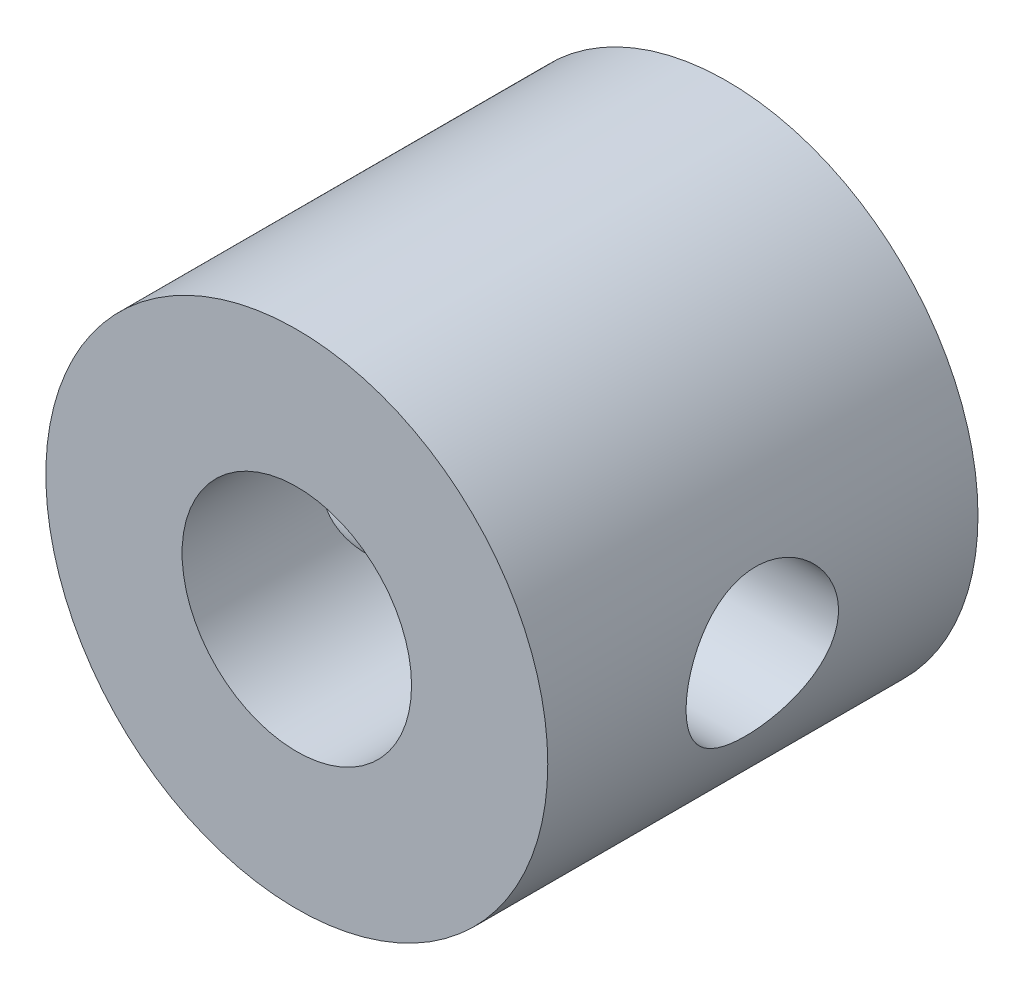
ISO-10303-21;
HEADER;
FILE_DESCRIPTION(('STEP AP214'),'2;1');
FILE_NAME('part.step','',(''),(''),'','','');
FILE_SCHEMA(('AUTOMOTIVE_DESIGN { 1 0 10303 214 1 1 1 1 }'));
ENDSEC;
DATA;
#1=APPLICATION_CONTEXT('core data for automotive mechanical design processes');
#2=APPLICATION_PROTOCOL_DEFINITION('international standard','automotive_design',2000,#1);
#3=PRODUCT_CONTEXT('',#1,'mechanical');
#4=PRODUCT('Part','Part','',(#3));
#5=PRODUCT_RELATED_PRODUCT_CATEGORY('part','',(#4));
#6=PRODUCT_DEFINITION_FORMATION('','',#4);
#7=PRODUCT_DEFINITION_CONTEXT('part definition',#1,'design');
#8=PRODUCT_DEFINITION('design','',#6,#7);
#9=PRODUCT_DEFINITION_SHAPE('','',#8);
#10=(LENGTH_UNIT() NAMED_UNIT(*) SI_UNIT(.MILLI.,.METRE.));
#11=(NAMED_UNIT(*) PLANE_ANGLE_UNIT() SI_UNIT($,.RADIAN.));
#12=(NAMED_UNIT(*) SI_UNIT($,.STERADIAN.) SOLID_ANGLE_UNIT());
#13=UNCERTAINTY_MEASURE_WITH_UNIT(LENGTH_MEASURE(1.E-05),#10,'distance_accuracy_value','');
#14=(GEOMETRIC_REPRESENTATION_CONTEXT(3) GLOBAL_UNCERTAINTY_ASSIGNED_CONTEXT((#13)) GLOBAL_UNIT_ASSIGNED_CONTEXT((#10,
#11,#12)) REPRESENTATION_CONTEXT('',''));
#15=CARTESIAN_POINT('',(0.,0.,0.));
#16=DIRECTION('',(0.,0.,1.));
#17=DIRECTION('',(1.,0.,0.));
#18=AXIS2_PLACEMENT_3D('',#15,#16,#17);
#19=CARTESIAN_POINT('',(0.,0.,19.05));
#20=DIRECTION('',(0.,0.,1.));
#21=DIRECTION('',(1.,0.,0.));
#22=AXIS2_PLACEMENT_3D('',#19,#20,#21);
#23=PLANE('',#22);
#24=CARTESIAN_POINT('',(0.,0.,19.05));
#25=DIRECTION('',(0.,0.,1.));
#26=DIRECTION('',(1.,0.,0.));
#27=AXIS2_PLACEMENT_3D('',#24,#25,#26);
#28=CIRCLE('',#27,11.1125);
#29=CARTESIAN_POINT('',(11.1125,0.,19.05));
#30=VERTEX_POINT('',#29);
#31=EDGE_CURVE('E10',#30,#30,#28,.T.);
#32=ORIENTED_EDGE('',*,*,#31,.T.);
#33=EDGE_LOOP('',(#32));
#34=FACE_BOUND('',#33,.T.);
#35=CARTESIAN_POINT('',(0.,0.,19.05));
#36=DIRECTION('',(0.,0.,1.));
#37=DIRECTION('',(1.,0.,0.));
#38=AXIS2_PLACEMENT_3D('',#35,#36,#37);
#39=CIRCLE('',#38,5.08);
#40=CARTESIAN_POINT('',(5.08,0.,19.05));
#41=VERTEX_POINT('',#40);
#42=EDGE_CURVE('E49',#41,#41,#39,.T.);
#43=ORIENTED_EDGE('',*,*,#42,.F.);
#44=EDGE_LOOP('',(#43));
#45=FACE_BOUND('',#44,.T.);
#46=ADVANCED_FACE('F31',(#34,#45),#23,.T.);
#47=CARTESIAN_POINT('',(0.,0.,0.));
#48=DIRECTION('',(0.,0.,1.));
#49=DIRECTION('',(1.,0.,0.));
#50=AXIS2_PLACEMENT_3D('',#47,#48,#49);
#51=PLANE('',#50);
#52=CARTESIAN_POINT('',(0.,0.,0.));
#53=DIRECTION('',(0.,0.,1.));
#54=DIRECTION('',(1.,0.,0.));
#55=AXIS2_PLACEMENT_3D('',#52,#53,#54);
#56=CIRCLE('',#55,11.1125);
#57=CARTESIAN_POINT('',(11.1125,0.,0.));
#58=VERTEX_POINT('',#57);
#59=EDGE_CURVE('E44',#58,#58,#56,.T.);
#60=ORIENTED_EDGE('',*,*,#59,.F.);
#61=EDGE_LOOP('',(#60));
#62=FACE_BOUND('',#61,.T.);
#63=CARTESIAN_POINT('',(0.,0.,0.));
#64=DIRECTION('',(0.,0.,1.));
#65=DIRECTION('',(1.,0.,0.));
#66=AXIS2_PLACEMENT_3D('',#63,#64,#65);
#67=CIRCLE('',#66,5.08);
#68=CARTESIAN_POINT('',(5.08,0.,0.));
#69=VERTEX_POINT('',#68);
#70=EDGE_CURVE('E52',#69,#69,#67,.T.);
#71=ORIENTED_EDGE('',*,*,#70,.T.);
#72=EDGE_LOOP('',(#71));
#73=FACE_BOUND('',#72,.T.);
#74=ADVANCED_FACE('F85',(#62,#73),#51,.F.);
#75=CARTESIAN_POINT('',(0.,0.,19.05));
#76=DIRECTION('',(0.,0.,-1.));
#77=DIRECTION('',(-1.,0.,0.));
#78=AXIS2_PLACEMENT_3D('',#75,#76,#77);
#79=CYLINDRICAL_SURFACE('',#78,11.1125);
#80=CARTESIAN_POINT('',(-11.1125,0.,12.8137149679314));
#81=CARTESIAN_POINT('',(-11.1124984958869,-0.179075031938462,12.8526354495436));
#82=CARTESIAN_POINT('',(-11.1081310056165,-0.361354755887228,12.8768895467676));
#83=CARTESIAN_POINT('',(-11.0902051525725,-0.726991149455643,12.8954539288409));
#84=CARTESIAN_POINT('',(-11.0766457779454,-0.910347935436447,12.8897609166105));
#85=CARTESIAN_POINT('',(-11.040883401534,-1.27266099769968,12.8489419987937));
#86=CARTESIAN_POINT('',(-11.0186898192915,-1.45162184433142,12.8138481203019));
#87=CARTESIAN_POINT('',(-10.9670727726402,-1.80058790649614,12.7156951163462));
#88=CARTESIAN_POINT('',(-10.9376482444434,-1.97059179984501,12.652631875042));
#89=CARTESIAN_POINT('',(-10.8729596061058,-2.30117890194719,12.4988829801458));
#90=CARTESIAN_POINT('',(-10.8375794531389,-2.4614657853009,12.4076102258045));
#91=CARTESIAN_POINT('',(-10.7642297854076,-2.76466688084742,12.2005148699386));
#92=CARTESIAN_POINT('',(-10.7262595254629,-2.90757606024488,12.0846851829464));
#93=CARTESIAN_POINT('',(-10.6491431055406,-3.17870581915587,11.8255419566447));
#94=CARTESIAN_POINT('',(-10.6100205953806,-3.30598001546618,11.6812286770229));
#95=CARTESIAN_POINT('',(-10.5360832001716,-3.53455499799976,11.372297273104));
#96=CARTESIAN_POINT('',(-10.5012684496236,-3.63585497333743,11.2076785151306));
#97=CARTESIAN_POINT('',(-10.4397941021162,-3.80877557453693,10.8632245172453));
#98=CARTESIAN_POINT('',(-10.4130908236302,-3.88055593634923,10.6834776877716));
#99=CARTESIAN_POINT('',(-10.370723584819,-3.99241577506109,10.3131638919057));
#100=CARTESIAN_POINT('',(-10.3550534436487,-4.03251300262836,10.1226030483679));
#101=CARTESIAN_POINT('',(-10.3372964071536,-4.07780671225773,9.74872603845862));
#102=CARTESIAN_POINT('',(-10.3344314952299,-4.08500285712875,9.56568774009725));
#103=CARTESIAN_POINT('',(-10.3404900799236,-4.06964262018829,9.20108138933902));
#104=CARTESIAN_POINT('',(-10.3494118039243,-4.04709071224907,9.01951311999297));
#105=CARTESIAN_POINT('',(-10.3775348352611,-3.97439994878839,8.66906657167486));
#106=CARTESIAN_POINT('',(-10.3963929965016,-3.9251805158688,8.49996767946618));
#107=CARTESIAN_POINT('',(-10.4422404357623,-3.80152523070773,8.1724475067097));
#108=CARTESIAN_POINT('',(-10.4692313459411,-3.72708431640212,8.01402837729684));
#109=CARTESIAN_POINT('',(-10.5301220309247,-3.55150039185283,7.70492409807499));
#110=CARTESIAN_POINT('',(-10.5642680682432,-3.44935086861727,7.55486018950909));
#111=CARTESIAN_POINT('',(-10.6355860385673,-3.22274107008864,7.27344422087008));
#112=CARTESIAN_POINT('',(-10.6727589870526,-3.09827329040754,7.14209848141968));
#113=CARTESIAN_POINT('',(-10.7492153163253,-2.8220057816087,6.89388747621948));
#114=CARTESIAN_POINT('',(-10.788494410734,-2.66903008040879,6.77832588237892));
#115=CARTESIAN_POINT('',(-10.8635166833034,-2.34505414127678,6.57449194480493));
#116=CARTESIAN_POINT('',(-10.8992597272806,-2.17405321984427,6.48622063639453));
#117=CARTESIAN_POINT('',(-10.9642576398156,-1.81809323381588,6.33965267163597));
#118=CARTESIAN_POINT('',(-10.9935011657997,-1.63311051107308,6.28140818625076));
#119=CARTESIAN_POINT('',(-11.0430777176784,-1.25476347431372,6.19745654718428));
#120=CARTESIAN_POINT('',(-11.0634138134944,-1.0614020732743,6.17173817768911));
#121=CARTESIAN_POINT('',(-11.0931603558285,-0.68127505866541,6.15454061996468));
#122=CARTESIAN_POINT('',(-11.103028676321,-0.494613128781895,6.16154674297758));
#123=CARTESIAN_POINT('',(-11.1133386408661,-0.124780310168476,6.20639408045858));
#124=CARTESIAN_POINT('',(-11.1137816002833,0.058391062124508,6.24423099154359));
#125=CARTESIAN_POINT('',(-11.1062573317802,0.41119731401626,6.34825871203173));
#126=CARTESIAN_POINT('',(-11.0985040351713,0.581058146600553,6.41370276162586));
#127=CARTESIAN_POINT('',(-11.0765771595107,0.907699396683724,6.57086165180119));
#128=CARTESIAN_POINT('',(-11.0624028563396,1.06447833652981,6.66257945493631));
#129=CARTESIAN_POINT('',(-11.0295081071124,1.36412335640241,6.87193319168137));
#130=CARTESIAN_POINT('',(-11.0106977613136,1.50662458368296,6.9900767650067));
#131=CARTESIAN_POINT('',(-10.9713971566341,1.77028372102719,7.24795130855053));
#132=CARTESIAN_POINT('',(-10.9509065731471,1.89143749265963,7.38768645469176));
#133=CARTESIAN_POINT('',(-10.910452073569,2.11251499122834,7.68955384367131));
#134=CARTESIAN_POINT('',(-10.8905209270152,2.2117168187426,7.85222027439945));
#135=CARTESIAN_POINT('',(-10.8546781599764,2.38142390343155,8.19230642469252));
#136=CARTESIAN_POINT('',(-10.8387662515409,2.45193121659029,8.36972508615137));
#137=CARTESIAN_POINT('',(-10.8133554811772,2.56167519178917,8.73313276866773));
#138=CARTESIAN_POINT('',(-10.8038141086656,2.60111946145896,8.91905594901472));
#139=CARTESIAN_POINT('',(-10.7923782866731,2.64817563557378,9.29510522197456));
#140=CARTESIAN_POINT('',(-10.7904824083849,2.65579348782107,9.48523052260732));
#141=CARTESIAN_POINT('',(-10.7945595895509,2.63916524082101,9.85904650985719));
#142=CARTESIAN_POINT('',(-10.8003305435609,2.61573757341234,10.0427765025938));
#143=CARTESIAN_POINT('',(-10.8185739484829,2.53922057986665,10.4035979189015));
#144=CARTESIAN_POINT('',(-10.8310467094008,2.48612988160114,10.5806890349725));
#145=CARTESIAN_POINT('',(-10.861030140562,2.35168230630612,10.92406493944));
#146=CARTESIAN_POINT('',(-10.8785590640075,2.27022279031239,11.0903078496124));
#147=CARTESIAN_POINT('',(-10.9162640628714,2.08136426059485,11.4070324703487));
#148=CARTESIAN_POINT('',(-10.9364407156113,1.97395958537844,11.5575107306199));
#149=CARTESIAN_POINT('',(-10.9772648126028,1.73281039430189,11.8426634738809));
#150=CARTESIAN_POINT('',(-10.99791045191,1.59843946658581,11.9768090618692));
#151=CARTESIAN_POINT('',(-11.0361178744893,1.30883086033706,12.2207976884783));
#152=CARTESIAN_POINT('',(-11.0536803305091,1.15359774699849,12.3306460300993));
#153=CARTESIAN_POINT('',(-11.0820065820158,0.836905042529225,12.5167115754777));
#154=CARTESIAN_POINT('',(-11.0931326893706,0.676474820539089,12.5946275051758));
#155=CARTESIAN_POINT('',(-11.1083793838198,0.345037137411955,12.7242142065518));
#156=CARTESIAN_POINT('',(-11.1125014617544,0.174031935242166,12.7758905618028));
#157=CARTESIAN_POINT('',(-11.1125,0.,12.8137149679314));
#158=B_SPLINE_CURVE_WITH_KNOTS('',3,(#80,#81,#82,#83,#84,#85,#86,#87,#88,#89,#90,#91,#92,#93,
#94,#95,#96,#97,#98,#99,#100,#101,#102,#103,#104,#105,#106,#107,#108,#109,#110,#111,#112,#113,
#114,#115,#116,#117,#118,#119,#120,#121,#122,#123,#124,#125,#126,#127,#128,#129,#130,#131,#132,
#133,#134,#135,#136,#137,#138,#139,#140,#141,#142,#143,#144,#145,#146,#147,#148,#149,#150,#151,
#152,#153,#154,#155,#156,#157),.UNSPECIFIED.,.T.,.F.,(4,2,2,2,2,2,2,2,2,2,2,2,2,2,2,2,2,2,2,2,2,
2,2,2,2,2,2,2,2,2,2,2,2,2,2,2,2,2,4),(0.,0.549127386282516,1.09831523097779,1.6469056083984,
2.19557674060791,2.75653813552192,3.31766160671913,3.90395420853996,4.49026511151996,
5.07336025617641,5.65612848615778,6.20296068401521,6.74971065200323,7.27870956974196,
7.80781472288579,8.35956628267514,8.91150371490862,9.49586001754957,10.0802384864414,
10.665628907149,11.2508174155907,11.8091954410905,12.3674955411408,12.9115749923452,
13.4557158165696,14.0113775333627,14.5671468528539,15.1391187441998,15.7110496461013,
16.2791248581159,16.8470939020322,17.4003838498336,17.953699393393,18.509038006302,
19.0644979092763,19.634780661926,20.2049388243133,20.7387153602167,21.2723782650602),.UNSPECIFIED.);
#159=CARTESIAN_POINT('',(-11.1125,0.,12.8137149679314));
#160=VERTEX_POINT('',#159);
#161=EDGE_CURVE('E75',#160,#160,#158,.T.);
#162=ORIENTED_EDGE('',*,*,#161,.T.);
#163=EDGE_LOOP('',(#162));
#164=FACE_BOUND('',#163,.T.);
#165=CARTESIAN_POINT('',(11.0894865589123,-0.714803546230769,6.1595));
#166=CARTESIAN_POINT('',(11.0774362689818,-0.90171037569798,6.1595034881902));
#167=CARTESIAN_POINT('',(11.0606173226472,-1.08834355431846,6.17512348101128));
#168=CARTESIAN_POINT('',(11.0183154927994,-1.45554142560708,6.23674833216527));
#169=CARTESIAN_POINT('',(10.9928284674406,-1.63610317177076,6.28276772608956));
#170=CARTESIAN_POINT('',(10.9350553116059,-1.98584906520534,6.40327250988253));
#171=CARTESIAN_POINT('',(10.9027829103269,-2.15505529025898,6.47770066312835));
#172=CARTESIAN_POINT('',(10.8338671096535,-2.47837442416594,6.6526809697907));
#173=CARTESIAN_POINT('',(10.7972231500031,-2.63248539380249,6.75323647362061));
#174=CARTESIAN_POINT('',(10.7211945577202,-2.92704259465505,6.98167621238763));
#175=CARTESIAN_POINT('',(10.6817590918277,-3.06684501808626,7.11037427643324));
#176=CARTESIAN_POINT('',(10.6048318040681,-3.32312157377473,7.38976917210141));
#177=CARTESIAN_POINT('',(10.5673403515226,-3.43959128525562,7.54047016321701));
#178=CARTESIAN_POINT('',(10.4973818133805,-3.64758793171963,7.86285363897419));
#179=CARTESIAN_POINT('',(10.4650039547497,-3.73868947093693,8.03483126936514));
#180=CARTESIAN_POINT('',(10.4096222009368,-3.89024281941935,8.39319845442483));
#181=CARTESIAN_POINT('',(10.3866140264043,-3.95070862381761,8.57958138347929));
#182=CARTESIAN_POINT('',(10.353656077701,-4.03626982591236,8.95142565308598));
#183=CARTESIAN_POINT('',(10.3431047246295,-4.06299942422847,9.13645686481424));
#184=CARTESIAN_POINT('',(10.3342718231912,-4.0854190778504,9.50865517542509));
#185=CARTESIAN_POINT('',(10.3359861589379,-4.08111954531729,9.69582153678815));
#186=CARTESIAN_POINT('',(10.3510577606483,-4.04272464353268,10.0567733197591));
#187=CARTESIAN_POINT('',(10.3638116622522,-4.01017313351193,10.2307518427967));
#188=CARTESIAN_POINT('',(10.3987785213806,-3.91860192515021,10.5705838617634));
#189=CARTESIAN_POINT('',(10.4209927170687,-3.85957876214466,10.7364362909797));
#190=CARTESIAN_POINT('',(10.4732491343126,-3.71546472160575,11.0594674826909));
#191=CARTESIAN_POINT('',(10.5034513924114,-3.62983381447909,11.2163784724948));
#192=CARTESIAN_POINT('',(10.5686269432523,-3.43544322220863,11.5140542865591));
#193=CARTESIAN_POINT('',(10.6036017470203,-3.32667620586908,11.6548139711002));
#194=CARTESIAN_POINT('',(10.6776424274546,-3.08107919139164,11.9255861781834));
#195=CARTESIAN_POINT('',(10.7168270882604,-2.94290692396576,12.0543509939404));
#196=CARTESIAN_POINT('',(10.7937856098382,-2.64674121742224,12.2871912646495));
#197=CARTESIAN_POINT('',(10.8315592006604,-2.48874401056905,12.3912620155891));
#198=CARTESIAN_POINT('',(10.9033499518472,-2.1528465216072,12.5739338242202));
#199=CARTESIAN_POINT('',(10.9372593586045,-1.97456890580185,12.6518864679246));
#200=CARTESIAN_POINT('',(10.997405799992,-1.60608598099178,12.7761504090063));
#201=CARTESIAN_POINT('',(11.0236450485395,-1.4158841330907,12.8224708418856));
#202=CARTESIAN_POINT('',(11.0656352232406,-1.03653819420611,12.880367952555));
#203=CARTESIAN_POINT('',(11.0817436087661,-0.847623533917535,12.8931862234456));
#204=CARTESIAN_POINT('',(11.1041781233081,-0.469760962150397,12.8868781966615));
#205=CARTESIAN_POINT('',(11.1105065627397,-0.280813069074733,12.8677594460124));
#206=CARTESIAN_POINT('',(11.1136241949128,0.084131617041397,12.7993627306639));
#207=CARTESIAN_POINT('',(11.1107675011155,0.26034759152064,12.7512610773991));
#208=CARTESIAN_POINT('',(11.0974793996069,0.602435466564587,12.6273492280379));
#209=CARTESIAN_POINT('',(11.0870476228801,0.768306862771985,12.5515376821603));
#210=CARTESIAN_POINT('',(11.060407375251,1.08664987552319,12.3736647788361));
#211=CARTESIAN_POINT('',(11.0441504871295,1.23899540978769,12.2713854677239));
#212=CARTESIAN_POINT('',(11.0083254207357,1.52486626419218,12.0437052922081));
#213=CARTESIAN_POINT('',(10.9887565811979,1.65838781615061,11.9182998099749));
#214=CARTESIAN_POINT('',(10.9483403258901,1.90734110308292,11.6431317127503));
#215=CARTESIAN_POINT('',(10.927472025495,2.02203773615674,11.4927062377104));
#216=CARTESIAN_POINT('',(10.8880095239228,2.22477162884951,11.1745658285624));
#217=CARTESIAN_POINT('',(10.869415404095,2.31280793497375,11.0068502763697));
#218=CARTESIAN_POINT('',(10.8370321567161,2.46011150180335,10.6575381528519));
#219=CARTESIAN_POINT('',(10.8232731776747,2.51919912861008,10.4758628043934));
#220=CARTESIAN_POINT('',(10.802741265759,2.60584958129114,10.1047737687435));
#221=CARTESIAN_POINT('',(10.7959668738064,2.63341899144347,9.91536170634802));
#222=CARTESIAN_POINT('',(10.7904831678966,2.65579644055077,9.53937076927706));
#223=CARTESIAN_POINT('',(10.7915720617277,2.65142415177613,9.35284329003558));
#224=CARTESIAN_POINT('',(10.8011801999979,2.61200389125932,8.98326478884971));
#225=CARTESIAN_POINT('',(10.8096992676483,2.57695664937674,8.80021368429661));
#226=CARTESIAN_POINT('',(10.8328611789008,2.47776421692628,8.44427968970762));
#227=CARTESIAN_POINT('',(10.8474519023389,2.41386629790257,8.27132421298773));
#228=CARTESIAN_POINT('',(10.8807665941468,2.25894292023291,7.93845111708284));
#229=CARTESIAN_POINT('',(10.8994911932267,2.16791332133478,7.77853549250576));
#230=CARTESIAN_POINT('',(10.9390549443603,1.95865093772055,7.47207761112807));
#231=CARTESIAN_POINT('',(10.9599344940666,1.83980952966305,7.32595599860881));
#232=CARTESIAN_POINT('',(11.0004861268739,1.57933526707559,7.05542899071608));
#233=CARTESIAN_POINT('',(11.0201580147087,1.43769874015512,6.93102710122618));
#234=CARTESIAN_POINT('',(11.0556227887695,1.13339631309986,6.70595628570269));
#235=CARTESIAN_POINT('',(11.0713635003088,0.970487226366919,6.60560722694832));
#236=CARTESIAN_POINT('',(11.0959587845958,0.62965271842683,6.43381926175959));
#237=CARTESIAN_POINT('',(11.1048172756765,0.451735905803194,6.36236391606762));
#238=CARTESIAN_POINT('',(11.1131001043853,0.10979502761421,6.2578359164126));
#239=CARTESIAN_POINT('',(11.11359335521,-0.0530635245944424,6.22100287714884));
#240=CARTESIAN_POINT('',(11.1071423192936,-0.382288155195273,6.1718342755893));
#241=CARTESIAN_POINT('',(11.1001985833785,-0.54865397292454,6.1594968991967));
#242=CARTESIAN_POINT('',(11.0894865589123,-0.714803546230769,6.1595));
#243=B_SPLINE_CURVE_WITH_KNOTS('',3,(#165,#166,#167,#168,#169,#170,#171,#172,#173,#174,#175,
#176,#177,#178,#179,#180,#181,#182,#183,#184,#185,#186,#187,#188,#189,#190,#191,#192,#193,#194,
#195,#196,#197,#198,#199,#200,#201,#202,#203,#204,#205,#206,#207,#208,#209,#210,#211,#212,#213,
#214,#215,#216,#217,#218,#219,#220,#221,#222,#223,#224,#225,#226,#227,#228,#229,#230,#231,#232,
#233,#234,#235,#236,#237,#238,#239,#240,#241,#242),.UNSPECIFIED.,.T.,.F.,(4,2,2,2,2,2,2,2,2,2,2,
2,2,2,2,2,2,2,2,2,2,2,2,2,2,2,2,2,2,2,2,2,2,2,2,2,2,2,4),(0.,0.561259288418712,1.12278713958484,
1.68318957227557,2.24366390308143,2.82321883061763,3.40288346098845,3.99175182580406,
4.58035093843166,5.13918157876881,5.69782470615076,6.22773521218344,6.75771509424558,
7.29924410712919,7.84094497194538,8.41699998950867,8.99316465279004,9.58272489496707,
10.172114797829,10.7393301801951,11.3064115430677,11.8518962104931,12.3974074526549,
12.9475622642076,13.4978270497557,14.0661017318418,14.6343967356188,15.2061748455012,
15.7778334868743,16.3348750068625,16.8919032733326,17.4442454503477,17.9966719571115,
18.5625548838514,19.1285290681619,19.7016573131627,20.2744590129095,20.7734236491327,
21.2723513317153),.UNSPECIFIED.);
#244=CARTESIAN_POINT('',(11.0894865589123,-0.714803546230769,6.1595));
#245=VERTEX_POINT('',#244);
#246=EDGE_CURVE('E71',#245,#245,#243,.T.);
#247=ORIENTED_EDGE('',*,*,#246,.T.);
#248=EDGE_LOOP('',(#247));
#249=FACE_BOUND('',#248,.T.);
#250=ORIENTED_EDGE('',*,*,#31,.F.);
#251=EDGE_LOOP('',(#250));
#252=FACE_BOUND('',#251,.T.);
#253=ORIENTED_EDGE('',*,*,#59,.T.);
#254=EDGE_LOOP('',(#253));
#255=FACE_BOUND('',#254,.T.);
#256=ADVANCED_FACE('F33',(#164,#249,#252,#255),#79,.T.);
#257=CARTESIAN_POINT('',(0.,0.,19.05));
#258=DIRECTION('',(0.,0.,-1.));
#259=DIRECTION('',(-1.,0.,0.));
#260=AXIS2_PLACEMENT_3D('',#257,#258,#259);
#261=CYLINDRICAL_SURFACE('',#260,5.08);
#262=CARTESIAN_POINT('',(-5.08,0.,12.8137149679314));
#263=CARTESIAN_POINT('',(-5.07999607532594,-0.16096112923543,12.8486960962939));
#264=CARTESIAN_POINT('',(-5.07228532712019,-0.32454255063629,12.8718137609901));
#265=CARTESIAN_POINT('',(-5.04069509935686,-0.651790846414018,12.8939068979416));
#266=CARTESIAN_POINT('',(-5.01681138202416,-0.815457731950644,12.8928760402224));
#267=CARTESIAN_POINT('',(-4.95374062899047,-1.13741008560304,12.8677542827962));
#268=CARTESIAN_POINT('',(-4.91459970226856,-1.29571022043197,12.8437325487056));
#269=CARTESIAN_POINT('',(-4.82293476611453,-1.60360392372916,12.7748534642308));
#270=CARTESIAN_POINT('',(-4.77040595894147,-1.75319434728819,12.7299886396706));
#271=CARTESIAN_POINT('',(-4.65130642396911,-2.04904328481725,12.6189842746451));
#272=CARTESIAN_POINT('',(-4.58411850862763,-2.19465692012704,12.5518028513665));
#273=CARTESIAN_POINT('',(-4.44092111635649,-2.47163280518905,12.3999127093986));
#274=CARTESIAN_POINT('',(-4.36490786365903,-2.60298890825603,12.3151964765217));
#275=CARTESIAN_POINT('',(-4.19191341351681,-2.87489602728874,12.1124170361869));
#276=CARTESIAN_POINT('',(-4.0937360994771,-3.01223445481435,11.9910724301648));
#277=CARTESIAN_POINT('',(-3.89511544586785,-3.26501422292569,11.7286954642739));
#278=CARTESIAN_POINT('',(-3.79466953867556,-3.38042920122434,11.5876397515682));
#279=CARTESIAN_POINT('',(-3.60812268884403,-3.57833923204827,11.3009851083689));
#280=CARTESIAN_POINT('',(-3.52157148128782,-3.66293340291162,11.1571295810625));
#281=CARTESIAN_POINT('',(-3.35995016045458,-3.81170773849712,10.8532630756934));
#282=CARTESIAN_POINT('',(-3.28485600194449,-3.87593097089704,10.6932871360133));
#283=CARTESIAN_POINT('',(-3.17797964476859,-3.96358536229217,10.4116367442354));
#284=CARTESIAN_POINT('',(-3.14004847060128,-3.99349109665715,10.2943586213583));
#285=CARTESIAN_POINT('',(-3.07896607367678,-4.04077663990624,10.0536471590052));
#286=CARTESIAN_POINT('',(-3.05578397455777,-4.05818262621816,9.93022726529057));
#287=CARTESIAN_POINT('',(-3.02774527625375,-4.07915554943517,9.67897314647568));
#288=CARTESIAN_POINT('',(-3.02304491477953,-4.08260450592345,9.55111046613375));
#289=CARTESIAN_POINT('',(-3.03333254546134,-4.07496204506187,9.29659627470406));
#290=CARTESIAN_POINT('',(-3.04833362210322,-4.0638609644804,9.16994562486224));
#291=CARTESIAN_POINT('',(-3.09837037206481,-4.02586312484018,8.90564013163867));
#292=CARTESIAN_POINT('',(-3.13578143468481,-3.99708100288847,8.76872864731267));
#293=CARTESIAN_POINT('',(-3.2259351128409,-3.92467147551361,8.50407980400491));
#294=CARTESIAN_POINT('',(-3.27871958914153,-3.88100348078587,8.37636869739202));
#295=CARTESIAN_POINT('',(-3.3795595462684,-3.79319094165688,8.16114957319912));
#296=CARTESIAN_POINT('',(-3.42556948599709,-3.75182129833851,8.07149571640246));
#297=CARTESIAN_POINT('',(-3.52112847633627,-3.66228602650608,7.89757618098496));
#298=CARTESIAN_POINT('',(-3.57067927395675,-3.61411703169516,7.81331320155086));
#299=CARTESIAN_POINT('',(-3.67184882558347,-3.51128728971437,7.65000937522463));
#300=CARTESIAN_POINT('',(-3.72346996059497,-3.45661891727028,7.57097483504336));
#301=CARTESIAN_POINT('',(-3.82751117989493,-3.34104861039762,7.41820158289688));
#302=CARTESIAN_POINT('',(-3.8799311331528,-3.28014768912656,7.34446201349189));
#303=CARTESIAN_POINT('',(-3.98656473904349,-3.14977083526839,7.19962414336771));
#304=CARTESIAN_POINT('',(-4.04077055277744,-3.08005644648477,7.12873383687914));
#305=CARTESIAN_POINT('',(-4.147959891731,-2.93411795442511,6.99296994628336));
#306=CARTESIAN_POINT('',(-4.20094293187025,-2.85789132223338,6.92809872016751));
#307=CARTESIAN_POINT('',(-4.35644569804734,-2.61983831817803,6.74332593767795));
#308=CARTESIAN_POINT('',(-4.4558237277803,-2.44827829807603,6.63286175677089));
#309=CARTESIAN_POINT('',(-4.62057219489065,-2.11749399844562,6.46125691620388));
#310=CARTESIAN_POINT('',(-4.68878346822377,-1.96251790431025,6.3946844184292));
#311=CARTESIAN_POINT('',(-4.7806388300293,-1.72028495528392,6.31207409111915));
#312=CARTESIAN_POINT('',(-4.80952034695799,-1.63788793918133,6.28740753985437));
#313=CARTESIAN_POINT('',(-4.86337824724919,-1.47026791224215,6.24424642215505));
#314=CARTESIAN_POINT('',(-4.88835634784391,-1.38504616420585,6.22574913758615));
#315=CARTESIAN_POINT('',(-4.93420589277103,-1.21165780238724,6.19520520551164));
#316=CARTESIAN_POINT('',(-4.95504503989985,-1.12347386156381,6.18320811676909));
#317=CARTESIAN_POINT('',(-4.99206143449052,-0.945504821064094,6.16622735689));
#318=CARTESIAN_POINT('',(-5.00824090728166,-0.8557205075086,6.16124033351266));
#319=CARTESIAN_POINT('',(-5.0357395894031,-0.675310447666253,6.15852384426088));
#320=CARTESIAN_POINT('',(-5.04705983697994,-0.584684885356743,6.16079282715523));
#321=CARTESIAN_POINT('',(-5.06477256830035,-0.40346763504317,6.17269923659503));
#322=CARTESIAN_POINT('',(-5.07116555578828,-0.312875944522959,6.18233590969514));
#323=CARTESIAN_POINT('',(-5.0821150879965,-0.062947718918252,6.21929794915035));
#324=CARTESIAN_POINT('',(-5.08145628804318,0.0955445692914031,6.25453266924276));
#325=CARTESIAN_POINT('',(-5.06620275875691,0.405070940175973,6.34716509540418));
#326=CARTESIAN_POINT('',(-5.05160681782545,0.556104373229118,6.4045647280788));
#327=CARTESIAN_POINT('',(-5.01085503231732,0.848339660134303,6.54014928558147));
#328=CARTESIAN_POINT('',(-4.98460421559899,0.989449473980932,6.61850282744278));
#329=CARTESIAN_POINT('',(-4.92375020171787,1.25779612202908,6.79349084632694));
#330=CARTESIAN_POINT('',(-4.88914411692401,1.38502813786154,6.8901316410323));
#331=CARTESIAN_POINT('',(-4.81059944483312,1.63834819129939,7.11232733462042));
#332=CARTESIAN_POINT('',(-4.76603768198103,1.76241410574877,7.23996948859671));
#333=CARTESIAN_POINT('',(-4.67605032734876,1.98892886401374,7.5130411465421));
#334=CARTESIAN_POINT('',(-4.63062388244216,2.09135500840005,7.65848907816605));
#335=CARTESIAN_POINT('',(-4.5402828120499,2.2813064799777,7.97972051321989));
#336=CARTESIAN_POINT('',(-4.49583712534085,2.36645305040626,8.15707608209109));
#337=CARTESIAN_POINT('',(-4.43903674778145,2.47040573301877,8.43377541664818));
#338=CARTESIAN_POINT('',(-4.42174704534144,2.5010968553734,8.52779371376776));
#339=CARTESIAN_POINT('',(-4.39128745880157,2.55419965723976,8.71876894096878));
#340=CARTESIAN_POINT('',(-4.37811491118211,2.57661669123021,8.8157239264879));
#341=CARTESIAN_POINT('',(-4.35747656525313,2.61135444697563,9.00379485769171));
#342=CARTESIAN_POINT('',(-4.34963435197243,2.62434696555237,9.0947460014608));
#343=CARTESIAN_POINT('',(-4.33841630251759,2.64285113524372,9.27763964818085));
#344=CARTESIAN_POINT('',(-4.33503816081343,2.64836664799699,9.36958161465181));
#345=CARTESIAN_POINT('',(-4.33291954341982,2.65183233284957,9.55364607893385));
#346=CARTESIAN_POINT('',(-4.33417803309483,2.6497841927309,9.64576853188539));
#347=CARTESIAN_POINT('',(-4.34125423873883,2.63817145232591,9.8293336513674));
#348=CARTESIAN_POINT('',(-4.34707171684782,2.62860724418176,9.92077635311186));
#349=CARTESIAN_POINT('',(-4.36913394037184,2.5918858198662,10.1720314043342));
#350=CARTESIAN_POINT('',(-4.38995655794645,2.55685638929903,10.3303671188641));
#351=CARTESIAN_POINT('',(-4.4420813315967,2.4651657806369,10.6387058149248));
#352=CARTESIAN_POINT('',(-4.47338771034913,2.40849588484594,10.7887054103812));
#353=CARTESIAN_POINT('',(-4.54538933835892,2.26989003700435,11.08953508149));
#354=CARTESIAN_POINT('',(-4.58663661439404,2.18629075619229,11.2394648107343));
#355=CARTESIAN_POINT('',(-4.67184467984862,1.99774128437117,11.5244841317371));
#356=CARTESIAN_POINT('',(-4.71580777267903,1.89277279103441,11.6595608483986));
#357=CARTESIAN_POINT('',(-4.80714429638694,1.64830506791324,11.9290663764503));
#358=CARTESIAN_POINT('',(-4.85422437665167,1.50609656932224,12.0611562165239));
#359=CARTESIAN_POINT('',(-4.93894544745784,1.19934702020981,12.2999375577931));
#360=CARTESIAN_POINT('',(-4.97659711455458,1.0348315582039,12.4066577800534));
#361=CARTESIAN_POINT('',(-5.02961179414563,0.726684359136573,12.5699803997222));
#362=CARTESIAN_POINT('',(-5.04808417364913,0.586687707715503,12.6324568052441));
#363=CARTESIAN_POINT('',(-5.07327678497139,0.298553721085708,12.7379733509613));
#364=CARTESIAN_POINT('',(-5.08000366767781,0.150421041953542,12.7810244804703));
#365=CARTESIAN_POINT('',(-5.08,0.,12.8137149679314));
#366=B_SPLINE_CURVE_WITH_KNOTS('',3,(#262,#263,#264,#265,#266,#267,#268,#269,#270,#271,#272,
#273,#274,#275,#276,#277,#278,#279,#280,#281,#282,#283,#284,#285,#286,#287,#288,#289,#290,#291,
#292,#293,#294,#295,#296,#297,#298,#299,#300,#301,#302,#303,#304,#305,#306,#307,#308,#309,#310,
#311,#312,#313,#314,#315,#316,#317,#318,#319,#320,#321,#322,#323,#324,#325,#326,#327,#328,#329,
#330,#331,#332,#333,#334,#335,#336,#337,#338,#339,#340,#341,#342,#343,#344,#345,#346,#347,#348,
#349,#350,#351,#352,#353,#354,#355,#356,#357,#358,#359,#360,#361,#362,#363,#364,#365),
.UNSPECIFIED.,.T.,.F.,(4,2,2,2,2,2,2,2,2,2,2,2,2,2,2,2,2,2,2,2,2,2,2,2,2,2,2,2,2,2,2,2,2,2,2,2,
2,2,2,2,2,2,2,2,2,2,2,2,2,2,2,4),(0.,0.493578042965852,0.987285467403414,1.47951227870935,
1.97191573526385,2.49162736839316,3.01156217623202,3.6330175148572,4.25521546871846,
4.81753924654848,5.3786661260508,5.7578816922589,6.13630075689111,6.51791204372254,
6.89977690155362,7.33186273677342,7.76513629142768,8.0915278855682,8.41808164370597,
8.74502237766113,9.07191004859281,9.411264830529,9.7507519992374,10.4278840851382,
10.9713732497874,11.2432709153362,11.5150486259936,11.7888702643126,12.0625609154507,
12.3361930593218,12.6097972243702,13.0943313292291,13.5789075599624,14.0675070774138,
14.5562757001351,15.104504349134,15.6533052481899,16.2548595787015,16.5556822982894,
16.8563100012547,17.1325369021001,17.408621086006,17.6846436671695,17.9606518481294,
18.4488233862398,18.9371917883348,19.4647724581473,19.9928069064187,20.5890704593069,
21.1846557299475,21.6461746215486,22.1074320932188),.UNSPECIFIED.);
#367=CARTESIAN_POINT('',(-5.08,0.,12.8137149679314));
#368=VERTEX_POINT('',#367);
#369=EDGE_CURVE('E36',#368,#368,#366,.T.);
#370=ORIENTED_EDGE('',*,*,#369,.F.);
#371=EDGE_LOOP('',(#370));
#372=FACE_BOUND('',#371,.T.);
#373=CARTESIAN_POINT('',(5.0294588068992,-0.714803546230769,6.1595));
#374=CARTESIAN_POINT('',(5.01689005743868,-0.80323795064149,6.15950012782081));
#375=CARTESIAN_POINT('',(5.00198360814345,-0.891340792096838,6.16299066903062));
#376=CARTESIAN_POINT('',(4.96765911877305,-1.06616371684242,6.17674217369608));
#377=CARTESIAN_POINT('',(4.94823885795975,-1.15288309697158,6.18700647434252));
#378=CARTESIAN_POINT('',(4.90515825939615,-1.32424533174747,6.21400412369765));
#379=CARTESIAN_POINT('',(4.88149735994934,-1.40888790961945,6.230738329722));
#380=CARTESIAN_POINT('',(4.83028705386128,-1.57554562361047,6.27030177203414));
#381=CARTESIAN_POINT('',(4.80273588333169,-1.65755954705891,6.29313377733531));
#382=CARTESIAN_POINT('',(4.71525387520282,-1.89778993896705,6.36981190093456));
#383=CARTESIAN_POINT('',(4.65014950254258,-2.05153449680122,6.43206136828164));
#384=CARTESIAN_POINT('',(4.50963627913147,-2.34436409759422,6.57579698005017));
#385=CARTESIAN_POINT('',(4.43422649494639,-2.48344781059262,6.65728486751883));
#386=CARTESIAN_POINT('',(4.26619144047917,-2.76333482041232,6.84871197703846));
#387=CARTESIAN_POINT('',(4.17260636367411,-2.9019588385006,6.96098350784954));
#388=CARTESIAN_POINT('',(3.98168230299974,-3.15883123512473,7.2044995904653));
#389=CARTESIAN_POINT('',(3.88433830265524,-3.27705114631142,7.33577018762012));
#390=CARTESIAN_POINT('',(3.73978646536177,-3.43885378188963,7.54660183526954));
#391=CARTESIAN_POINT('',(3.69164079686915,-3.49038952373253,7.61954740175375));
#392=CARTESIAN_POINT('',(3.59691125752782,-3.58793011788582,7.77006907468457));
#393=CARTESIAN_POINT('',(3.5503277024505,-3.6339338567391,7.84764610864599));
#394=CARTESIAN_POINT('',(3.45996601882989,-3.72007062722899,8.00737711964231));
#395=CARTESIAN_POINT('',(3.41618364783888,-3.76021266075375,8.08952380525759));
#396=CARTESIAN_POINT('',(3.33282006316557,-3.83429515165892,8.25855833605319));
#397=CARTESIAN_POINT('',(3.29323644679359,-3.86823916389775,8.34544342615978));
#398=CARTESIAN_POINT('',(3.2099587973061,-3.93779827653263,8.54859625492365));
#399=CARTESIAN_POINT('',(3.16811877666222,-3.9713147026564,8.66638304324315));
#400=CARTESIAN_POINT('',(3.09868984134893,-4.02572910241551,8.90878264582159));
#401=CARTESIAN_POINT('',(3.07107105799711,-4.04665353858028,9.03338054050678));
#402=CARTESIAN_POINT('',(3.03413548739215,-4.07443346030625,9.28829378704982));
#403=CARTESIAN_POINT('',(3.02500952583482,-4.08114228830929,9.41865470731662));
#404=CARTESIAN_POINT('',(3.02749861073495,-4.07929552201127,9.67908256840324));
#405=CARTESIAN_POINT('',(3.03911623201244,-4.07073803276192,9.80914947072124));
#406=CARTESIAN_POINT('',(3.07824454365972,-4.04119886665583,10.0489655983271));
#407=CARTESIAN_POINT('',(3.10368151418155,-4.02183074496044,10.1592804142525));
#408=CARTESIAN_POINT('',(3.16569259457688,-3.9732019794767,10.3744807849761));
#409=CARTESIAN_POINT('',(3.20227789907833,-3.94393138882763,10.4793607579301));
#410=CARTESIAN_POINT('',(3.27785543581412,-3.88125387099612,10.6690083493725));
#411=CARTESIAN_POINT('',(3.31583383837134,-3.84896046958555,10.7545646609914));
#412=CARTESIAN_POINT('',(3.39601977150387,-3.77839956678185,10.9211199063986));
#413=CARTESIAN_POINT('',(3.43822867204045,-3.74013012791649,11.0021173505442));
#414=CARTESIAN_POINT('',(3.52557115607062,-3.65791636881378,11.1598100472151));
#415=CARTESIAN_POINT('',(3.57071149426499,-3.61395869249032,11.2364945448304));
#416=CARTESIAN_POINT('',(3.66268494255718,-3.52071551072724,11.385419544856));
#417=CARTESIAN_POINT('',(3.70951773680137,-3.4714309960227,11.4576608697407));
#418=CARTESIAN_POINT('',(3.85569703019175,-3.31082234392961,11.6745820329759));
#419=CARTESIAN_POINT('',(3.95639239878486,-3.19065813570742,11.8119629810227));
#420=CARTESIAN_POINT('',(4.15422512361298,-2.92844991277942,12.066591863714));
#421=CARTESIAN_POINT('',(4.25136605346488,-2.78642866540345,12.1838604825891));
#422=CARTESIAN_POINT('',(4.43131757879282,-2.48962165669855,12.3898473687957));
#423=CARTESIAN_POINT('',(4.51462740405637,-2.33600758077327,12.4798028507172));
#424=CARTESIAN_POINT('',(4.66836778398751,-2.01119836651302,12.6360011423378));
#425=CARTESIAN_POINT('',(4.73881002374921,-1.84001940179186,12.7022655188859));
#426=CARTESIAN_POINT('',(4.85309410903626,-1.50986955857267,12.7990631925682));
#427=CARTESIAN_POINT('',(4.89933339889814,-1.35286540274925,12.8334432445641));
#428=CARTESIAN_POINT('',(4.97681213695268,-1.0319510314948,12.8794342249845));
#429=CARTESIAN_POINT('',(5.00806067738767,-0.86804506796775,12.8910589682539));
#430=CARTESIAN_POINT('',(5.05424901629577,-0.53748822437795,12.8898979946262));
#431=CARTESIAN_POINT('',(5.06913950484704,-0.37083057378505,12.8770387896793));
#432=CARTESIAN_POINT('',(5.08252487700305,-0.0406427425184677,12.8265139917112));
#433=CARTESIAN_POINT('',(5.0810179265634,0.122887086260875,12.7888456242417));
#434=CARTESIAN_POINT('',(5.06370205492991,0.434166945723533,12.6922971835149));
#435=CARTESIAN_POINT('',(5.04857324721985,0.582297502705272,12.6345051428751));
#436=CARTESIAN_POINT('',(5.00742495524337,0.867702553130364,12.4994264543192));
#437=CARTESIAN_POINT('',(4.98140337568606,1.00497495189762,12.4221360569127));
#438=CARTESIAN_POINT('',(4.9190601484645,1.27680964067904,12.2432085459513));
#439=CARTESIAN_POINT('',(4.88207477890432,1.41025117725676,12.1401061709017));
#440=CARTESIAN_POINT('',(4.80306123767844,1.65955995508045,11.9160497082295));
#441=CARTESIAN_POINT('',(4.76102912153296,1.77541328733712,11.7950816397735));
#442=CARTESIAN_POINT('',(4.67079137451521,2.00169946711692,11.5207015011213));
#443=CARTESIAN_POINT('',(4.62249370992535,2.10946838185226,11.3651160335872));
#444=CARTESIAN_POINT('',(4.53169206144504,2.29808001622833,11.0365964765352));
#445=CARTESIAN_POINT('',(4.4891891574775,2.37891772095727,10.8636591636897));
#446=CARTESIAN_POINT('',(4.43471979132117,2.47812338893363,10.5932674930812));
#447=CARTESIAN_POINT('',(4.41804022445944,2.50762461235748,10.5007246455804));
#448=CARTESIAN_POINT('',(4.38870269757481,2.55862440506876,10.3128553543173));
#449=CARTESIAN_POINT('',(4.37604256645445,2.58012729573488,10.217530443775));
#450=CARTESIAN_POINT('',(4.3554228923761,2.61478472833726,10.0249910374402));
#451=CARTESIAN_POINT('',(4.34745772385778,2.62794926280865,9.92777894781732));
#452=CARTESIAN_POINT('',(4.33665501260459,2.64573881963697,9.73229875167704));
#453=CARTESIAN_POINT('',(4.33381660476167,2.65036528274166,9.63403082614093));
#454=CARTESIAN_POINT('',(4.33345864254952,2.65094969047263,9.45111472355206));
#455=CARTESIAN_POINT('',(4.33525541180475,2.64802186197346,9.36646960986771));
#456=CARTESIAN_POINT('',(4.34268167174551,2.63582219076426,9.1977992621357));
#457=CARTESIAN_POINT('',(4.34831237365903,2.62654834319542,9.11377423246933));
#458=CARTESIAN_POINT('',(4.37064443346249,2.58935675781842,8.8635855740049));
#459=CARTESIAN_POINT('',(4.39278599411404,2.55206912510775,8.69919183996107));
#460=CARTESIAN_POINT('',(4.44764742765085,2.45515970112105,8.38268446022656));
#461=CARTESIAN_POINT('',(4.48016081494108,2.39597052916608,8.23039816577486));
#462=CARTESIAN_POINT('',(4.55174430495263,2.25701667388697,7.93717097896588));
#463=CARTESIAN_POINT('',(4.59081710332646,2.17724352411309,7.79623478642087));
#464=CARTESIAN_POINT('',(4.67698185011012,1.98613157076337,7.50871033615813));
#465=CARTESIAN_POINT('',(4.72442730203267,1.87192680301576,7.36413152128808));
#466=CARTESIAN_POINT('',(4.81636950121023,1.62075072343266,7.09484734270839));
#467=CARTESIAN_POINT('',(4.86086434084609,1.48376488016178,6.97015476398885));
#468=CARTESIAN_POINT('',(4.92209406865089,1.2593114543021,6.79754160697045));
#469=CARTESIAN_POINT('',(4.94200642531395,1.17905939659281,6.74120005299632));
#470=CARTESIAN_POINT('',(4.9786085647224,1.01342737252895,6.63545903797751));
#471=CARTESIAN_POINT('',(4.99529988607092,0.928049880139128,6.58605626554576));
#472=CARTESIAN_POINT('',(5.02469480008889,0.752814924502411,6.49474566598252));
#473=CARTESIAN_POINT('',(5.03740188317726,0.662961462895789,6.45283129251719));
#474=CARTESIAN_POINT('',(5.05816706098479,0.479442886238262,6.37695021076052));
#475=CARTESIAN_POINT('',(5.06622610391777,0.385778552793219,6.34298188229378));
#476=CARTESIAN_POINT('',(5.07633688177273,0.209373970913723,6.28775660632192));
#477=CARTESIAN_POINT('',(5.07909178361288,0.127025897693615,6.26536949060671));
#478=CARTESIAN_POINT('',(5.08052858836162,-0.0391971069916073,6.22690610684055));
#479=CARTESIAN_POINT('',(5.07920939898705,-0.123072441929964,6.21083153251409));
#480=CARTESIAN_POINT('',(5.07232579314494,-0.291575905546689,6.18513061447784));
#481=CARTESIAN_POINT('',(5.06676422509008,-0.376203491484809,6.17549995234536));
#482=CARTESIAN_POINT('',(5.05133332224131,-0.545589340174778,6.16268317900068));
#483=CARTESIAN_POINT('',(5.04146211132778,-0.630347643801003,6.15949987792962));
#484=CARTESIAN_POINT('',(5.0294588068992,-0.714803546230769,6.1595));
#485=B_SPLINE_CURVE_WITH_KNOTS('',3,(#373,#374,#375,#376,#377,#378,#379,#380,#381,#382,#383,
#384,#385,#386,#387,#388,#389,#390,#391,#392,#393,#394,#395,#396,#397,#398,#399,#400,#401,#402,
#403,#404,#405,#406,#407,#408,#409,#410,#411,#412,#413,#414,#415,#416,#417,#418,#419,#420,#421,
#422,#423,#424,#425,#426,#427,#428,#429,#430,#431,#432,#433,#434,#435,#436,#437,#438,#439,#440,
#441,#442,#443,#444,#445,#446,#447,#448,#449,#450,#451,#452,#453,#454,#455,#456,#457,#458,#459,
#460,#461,#462,#463,#464,#465,#466,#467,#468,#469,#470,#471,#472,#473,#474,#475,#476,#477,#478,
#479,#480,#481,#482,#483,#484),.UNSPECIFIED.,.T.,.F.,(4,2,2,2,2,2,2,2,2,2,2,2,2,2,2,2,2,2,2,2,2,
2,2,2,2,2,2,2,2,2,2,2,2,2,2,2,2,2,2,2,2,2,2,2,2,2,2,2,2,2,2,2,2,2,2,4),(0.,0.267875157221401,
0.535882385644135,0.803925139406834,1.07208981907231,1.60426929351032,2.13649700320677,
2.7387177509435,3.34177202835253,3.64595156541905,3.95019222428382,4.25396062941182,
4.55755425794835,4.94447893560631,5.33058761113046,5.72066062342559,6.11078205732793,
6.45410441868376,6.79777267050528,7.09442998975077,7.39118368777833,7.68864726035404,
7.98605560277508,8.60912576106269,9.23155123863115,9.8188718563474,10.4056564457931,
10.9052315340023,11.4045032338664,11.9052758497999,12.4061044774465,12.883234938392,
13.360457220487,13.876345799792,14.3926402490817,14.9760725622852,15.5596134568827,
15.8549025259778,16.150031822301,16.444806768506,16.7395319686768,16.9933426312652,
17.2472335157393,17.7546704327929,18.252576980994,18.7506886518012,19.3190987827024,
19.887872887702,20.1876881999865,20.4873599420161,20.7867684162877,21.0861157887286,
21.3419313653409,21.5978155332745,21.8535280468333,22.1093519910595),.UNSPECIFIED.);
#486=CARTESIAN_POINT('',(5.0294588068992,-0.714803546230769,6.1595));
#487=VERTEX_POINT('',#486);
#488=EDGE_CURVE('E54',#487,#487,#485,.T.);
#489=ORIENTED_EDGE('',*,*,#488,.F.);
#490=EDGE_LOOP('',(#489));
#491=FACE_BOUND('',#490,.T.);
#492=ORIENTED_EDGE('',*,*,#42,.T.);
#493=EDGE_LOOP('',(#492));
#494=FACE_BOUND('',#493,.T.);
#495=ORIENTED_EDGE('',*,*,#70,.F.);
#496=EDGE_LOOP('',(#495));
#497=FACE_BOUND('',#496,.T.);
#498=ADVANCED_FACE('F58',(#372,#491,#494,#497),#261,.F.);
#499=CARTESIAN_POINT('',(-11.1125,-0.714803546230769,9.525));
#500=DIRECTION('',(1.,0.,0.));
#501=DIRECTION('',(0.,0.,-1.));
#502=AXIS2_PLACEMENT_3D('',#499,#500,#501);
#503=CYLINDRICAL_SURFACE('',#502,3.3655);
#504=ORIENTED_EDGE('',*,*,#488,.T.);
#505=EDGE_LOOP('',(#504));
#506=FACE_BOUND('',#505,.T.);
#507=ORIENTED_EDGE('',*,*,#246,.F.);
#508=EDGE_LOOP('',(#507));
#509=FACE_BOUND('',#508,.T.);
#510=ADVANCED_FACE('F64',(#506,#509),#503,.F.);
#511=ORIENTED_EDGE('',*,*,#369,.T.);
#512=EDGE_LOOP('',(#511));
#513=FACE_BOUND('',#512,.T.);
#514=ORIENTED_EDGE('',*,*,#161,.F.);
#515=EDGE_LOOP('',(#514));
#516=FACE_BOUND('',#515,.T.);
#517=ADVANCED_FACE('F61',(#513,#516),#503,.F.);
#518=CLOSED_SHELL('',(#46,#74,#256,#498,#510,#517));
#519=MANIFOLD_SOLID_BREP('B2',#518);
#520=ADVANCED_BREP_SHAPE_REPRESENTATION('',(#18,#519),#14);
#521=SHAPE_DEFINITION_REPRESENTATION(#9,#520);
ENDSEC;
END-ISO-10303-21;
